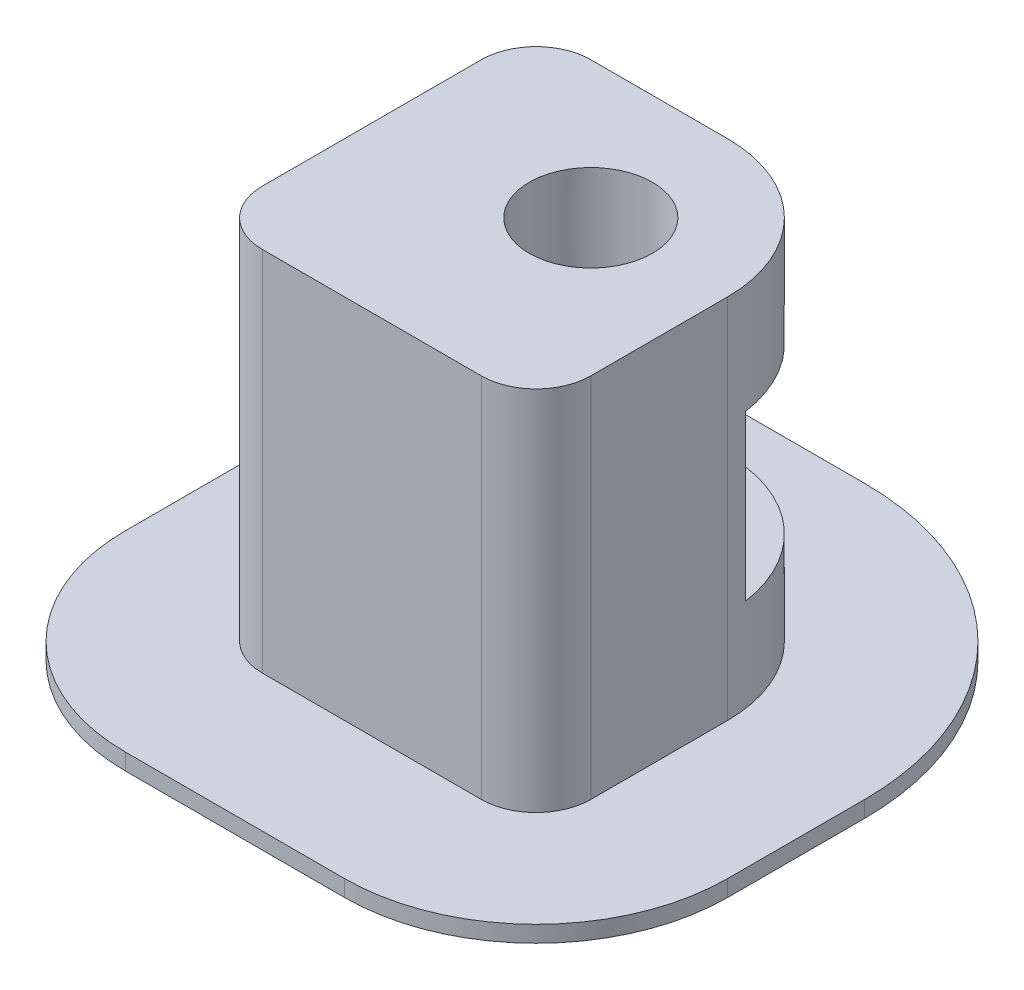
ISO-10303-21;
HEADER;
FILE_DESCRIPTION(('STEP AP214'),'2;1');
FILE_NAME('part.step','',(''),(''),'','','');
FILE_SCHEMA(('AUTOMOTIVE_DESIGN { 1 0 10303 214 1 1 1 1 }'));
ENDSEC;
DATA;
#1=APPLICATION_CONTEXT('core data for automotive mechanical design processes');
#2=APPLICATION_PROTOCOL_DEFINITION('international standard','automotive_design',2000,#1);
#3=PRODUCT_CONTEXT('',#1,'mechanical');
#4=PRODUCT('Part','Part','',(#3));
#5=PRODUCT_RELATED_PRODUCT_CATEGORY('part','',(#4));
#6=PRODUCT_DEFINITION_FORMATION('','',#4);
#7=PRODUCT_DEFINITION_CONTEXT('part definition',#1,'design');
#8=PRODUCT_DEFINITION('design','',#6,#7);
#9=PRODUCT_DEFINITION_SHAPE('','',#8);
#10=(LENGTH_UNIT() NAMED_UNIT(*) SI_UNIT(.MILLI.,.METRE.));
#11=(NAMED_UNIT(*) PLANE_ANGLE_UNIT() SI_UNIT($,.RADIAN.));
#12=(NAMED_UNIT(*) SI_UNIT($,.STERADIAN.) SOLID_ANGLE_UNIT());
#13=UNCERTAINTY_MEASURE_WITH_UNIT(LENGTH_MEASURE(1.E-05),#10,'distance_accuracy_value','');
#14=(GEOMETRIC_REPRESENTATION_CONTEXT(3) GLOBAL_UNCERTAINTY_ASSIGNED_CONTEXT((#13)) GLOBAL_UNIT_ASSIGNED_CONTEXT((#10,
#11,#12)) REPRESENTATION_CONTEXT('',''));
#15=CARTESIAN_POINT('',(0.,0.,0.));
#16=DIRECTION('',(0.,0.,1.));
#17=DIRECTION('',(1.,0.,0.));
#18=AXIS2_PLACEMENT_3D('',#15,#16,#17);
#19=CARTESIAN_POINT('',(0.,7.,0.));
#20=DIRECTION('',(0.,-1.,0.));
#21=DIRECTION('',(0.,0.,-1.));
#22=AXIS2_PLACEMENT_3D('',#19,#20,#21);
#23=CYLINDRICAL_SURFACE('',#22,5.);
#24=CARTESIAN_POINT('',(0.,-3.,0.));
#25=DIRECTION('',(0.,-1.,0.));
#26=DIRECTION('',(0.,0.,-1.));
#27=AXIS2_PLACEMENT_3D('',#24,#25,#26);
#28=CIRCLE('',#27,5.);
#29=CARTESIAN_POINT('',(0.707106781177616,-3.,-4.94974746830711));
#30=VERTEX_POINT('',#29);
#31=CARTESIAN_POINT('',(4.94974746830837,-3.,-0.707106781168817));
#32=VERTEX_POINT('',#31);
#33=EDGE_CURVE('E281',#30,#32,#28,.T.);
#34=ORIENTED_EDGE('',*,*,#33,.T.);
#35=DIRECTION('',(0.,-1.,0.));
#36=VECTOR('',#35,1.);
#37=CARTESIAN_POINT('',(4.94974746830334,7.,-0.707106781203986));
#38=LINE('',#37,#36);
#39=CARTESIAN_POINT('',(4.94974746829832,3.,-0.707106781239157));
#40=VERTEX_POINT('',#39);
#41=EDGE_CURVE('E346',#40,#32,#38,.T.);
#42=ORIENTED_EDGE('',*,*,#41,.F.);
#43=CARTESIAN_POINT('',(0.,3.,0.));
#44=DIRECTION('',(0.,-1.,0.));
#45=DIRECTION('',(0.,0.,-1.));
#46=AXIS2_PLACEMENT_3D('',#43,#44,#45);
#47=CIRCLE('',#46,5.);
#48=CARTESIAN_POINT('',(0.707106781203994,3.,-4.94974746830334));
#49=VERTEX_POINT('',#48);
#50=EDGE_CURVE('E300',#49,#40,#47,.T.);
#51=ORIENTED_EDGE('',*,*,#50,.F.);
#52=DIRECTION('',(0.,-1.,0.));
#53=VECTOR('',#52,1.);
#54=CARTESIAN_POINT('',(0.707106781203994,7.,-4.94974746830334));
#55=LINE('',#54,#53);
#56=EDGE_CURVE('E40',#30,#49,#55,.F.);
#57=ORIENTED_EDGE('',*,*,#56,.F.);
#58=EDGE_LOOP('',(#34,#42,#51,#57));
#59=FACE_BOUND('',#58,.T.);
#60=CARTESIAN_POINT('',(0.,-6.4,0.));
#61=DIRECTION('',(0.,-1.,0.));
#62=DIRECTION('',(0.,0.,-1.));
#63=AXIS2_PLACEMENT_3D('',#60,#61,#62);
#64=CIRCLE('',#63,5.);
#65=CARTESIAN_POINT('',(0.,-6.4,-5.));
#66=VERTEX_POINT('',#65);
#67=CARTESIAN_POINT('',(5.,-6.4,0.));
#68=VERTEX_POINT('',#67);
#69=EDGE_CURVE('E252',#66,#68,#64,.T.);
#70=ORIENTED_EDGE('',*,*,#69,.F.);
#71=DIRECTION('',(0.,-1.,0.));
#72=VECTOR('',#71,1.);
#73=CARTESIAN_POINT('',(0.,7.,-5.));
#74=LINE('',#73,#72);
#75=CARTESIAN_POINT('',(0.,7.,-5.));
#76=VERTEX_POINT('',#75);
#77=EDGE_CURVE('E322',#76,#66,#74,.T.);
#78=ORIENTED_EDGE('',*,*,#77,.F.);
#79=CARTESIAN_POINT('',(0.,7.,0.));
#80=DIRECTION('',(0.,1.,0.));
#81=DIRECTION('',(0.,0.,1.));
#82=AXIS2_PLACEMENT_3D('',#79,#80,#81);
#83=CIRCLE('',#82,5.);
#84=CARTESIAN_POINT('',(5.,7.,0.));
#85=VERTEX_POINT('',#84);
#86=EDGE_CURVE('E305',#85,#76,#83,.T.);
#87=ORIENTED_EDGE('',*,*,#86,.F.);
#88=DIRECTION('',(0.,-1.,0.));
#89=VECTOR('',#88,1.);
#90=CARTESIAN_POINT('',(5.,7.,0.));
#91=LINE('',#90,#89);
#92=EDGE_CURVE('E319',#85,#68,#91,.T.);
#93=ORIENTED_EDGE('',*,*,#92,.T.);
#94=EDGE_LOOP('',(#70,#78,#87,#93));
#95=FACE_BOUND('',#94,.T.);
#96=ADVANCED_FACE('F32',(#59,#95),#23,.T.);
#97=CARTESIAN_POINT('',(0.,7.,-5.));
#98=DIRECTION('',(0.,0.,1.));
#99=DIRECTION('',(1.,0.,0.));
#100=AXIS2_PLACEMENT_3D('',#97,#98,#99);
#101=PLANE('',#100);
#102=DIRECTION('',(1.,0.,0.));
#103=VECTOR('',#102,1.);
#104=CARTESIAN_POINT('',(0.,-6.4,-5.));
#105=LINE('',#104,#103);
#106=CARTESIAN_POINT('',(-5.,-6.4,-5.));
#107=VERTEX_POINT('',#106);
#108=EDGE_CURVE('E250',#107,#66,#105,.T.);
#109=ORIENTED_EDGE('',*,*,#108,.F.);
#110=DIRECTION('',(0.,-1.,0.));
#111=VECTOR('',#110,1.);
#112=CARTESIAN_POINT('',(-5.,7.,-5.));
#113=LINE('',#112,#111);
#114=CARTESIAN_POINT('',(-5.,7.,-5.));
#115=VERTEX_POINT('',#114);
#116=EDGE_CURVE('E344',#107,#115,#113,.F.);
#117=ORIENTED_EDGE('',*,*,#116,.T.);
#118=DIRECTION('',(-1.,0.,0.));
#119=VECTOR('',#118,1.);
#120=CARTESIAN_POINT('',(0.,7.,-5.));
#121=LINE('',#120,#119);
#122=EDGE_CURVE('E308',#76,#115,#121,.T.);
#123=ORIENTED_EDGE('',*,*,#122,.F.);
#124=ORIENTED_EDGE('',*,*,#77,.T.);
#125=EDGE_LOOP('',(#109,#117,#123,#124));
#126=FACE_BOUND('',#125,.T.);
#127=ADVANCED_FACE('F389',(#126),#101,.F.);
#128=CARTESIAN_POINT('',(-7.,7.,-5.));
#129=DIRECTION('',(1.,0.,0.));
#130=DIRECTION('',(0.,0.,-1.));
#131=AXIS2_PLACEMENT_3D('',#128,#129,#130);
#132=PLANE('',#131);
#133=DIRECTION('',(0.,0.,-1.));
#134=VECTOR('',#133,1.);
#135=CARTESIAN_POINT('',(-7.,-6.4,-5.));
#136=LINE('',#135,#134);
#137=CARTESIAN_POINT('',(-7.,-6.4,5.));
#138=VERTEX_POINT('',#137);
#139=CARTESIAN_POINT('',(-7.,-6.4,-3.));
#140=VERTEX_POINT('',#139);
#141=EDGE_CURVE('E47',#138,#140,#136,.T.);
#142=ORIENTED_EDGE('',*,*,#141,.F.);
#143=DIRECTION('',(0.,-1.,0.));
#144=VECTOR('',#143,1.);
#145=CARTESIAN_POINT('',(-7.,7.,5.));
#146=LINE('',#145,#144);
#147=CARTESIAN_POINT('',(-7.,7.,5.));
#148=VERTEX_POINT('',#147);
#149=EDGE_CURVE('E342',#138,#148,#146,.F.);
#150=ORIENTED_EDGE('',*,*,#149,.T.);
#151=DIRECTION('',(0.,0.,1.));
#152=VECTOR('',#151,1.);
#153=CARTESIAN_POINT('',(-7.,7.,-5.));
#154=LINE('',#153,#152);
#155=CARTESIAN_POINT('',(-7.,7.,-3.));
#156=VERTEX_POINT('',#155);
#157=EDGE_CURVE('E311',#156,#148,#154,.T.);
#158=ORIENTED_EDGE('',*,*,#157,.F.);
#159=DIRECTION('',(0.,-1.,0.));
#160=VECTOR('',#159,1.);
#161=CARTESIAN_POINT('',(-7.,7.,-3.));
#162=LINE('',#161,#160);
#163=EDGE_CURVE('E339',#156,#140,#162,.T.);
#164=ORIENTED_EDGE('',*,*,#163,.T.);
#165=EDGE_LOOP('',(#142,#150,#158,#164));
#166=FACE_BOUND('',#165,.T.);
#167=ADVANCED_FACE('F394',(#166),#132,.F.);
#168=CARTESIAN_POINT('',(-7.,7.,7.));
#169=DIRECTION('',(0.,0.,-1.));
#170=DIRECTION('',(-1.,0.,0.));
#171=AXIS2_PLACEMENT_3D('',#168,#169,#170);
#172=PLANE('',#171);
#173=DIRECTION('',(-1.,0.,0.));
#174=VECTOR('',#173,1.);
#175=CARTESIAN_POINT('',(-7.,-6.4,7.));
#176=LINE('',#175,#174);
#177=CARTESIAN_POINT('',(3.,-6.4,7.));
#178=VERTEX_POINT('',#177);
#179=CARTESIAN_POINT('',(-5.,-6.4,7.));
#180=VERTEX_POINT('',#179);
#181=EDGE_CURVE('E259',#178,#180,#176,.T.);
#182=ORIENTED_EDGE('',*,*,#181,.F.);
#183=DIRECTION('',(0.,-1.,0.));
#184=VECTOR('',#183,1.);
#185=CARTESIAN_POINT('',(3.,7.,7.));
#186=LINE('',#185,#184);
#187=CARTESIAN_POINT('',(3.,7.,7.));
#188=VERTEX_POINT('',#187);
#189=EDGE_CURVE('E331',#178,#188,#186,.F.);
#190=ORIENTED_EDGE('',*,*,#189,.T.);
#191=DIRECTION('',(1.,0.,0.));
#192=VECTOR('',#191,1.);
#193=CARTESIAN_POINT('',(-7.,7.,7.));
#194=LINE('',#193,#192);
#195=CARTESIAN_POINT('',(-5.,7.,7.));
#196=VERTEX_POINT('',#195);
#197=EDGE_CURVE('E314',#196,#188,#194,.T.);
#198=ORIENTED_EDGE('',*,*,#197,.F.);
#199=DIRECTION('',(0.,-1.,0.));
#200=VECTOR('',#199,1.);
#201=CARTESIAN_POINT('',(-5.,7.,7.));
#202=LINE('',#201,#200);
#203=EDGE_CURVE('E328',#196,#180,#202,.T.);
#204=ORIENTED_EDGE('',*,*,#203,.T.);
#205=EDGE_LOOP('',(#182,#190,#198,#204));
#206=FACE_BOUND('',#205,.T.);
#207=ADVANCED_FACE('F434',(#206),#172,.F.);
#208=CARTESIAN_POINT('',(5.,7.,7.));
#209=DIRECTION('',(-1.,0.,0.));
#210=DIRECTION('',(0.,0.,1.));
#211=AXIS2_PLACEMENT_3D('',#208,#209,#210);
#212=PLANE('',#211);
#213=DIRECTION('',(0.,0.,1.));
#214=VECTOR('',#213,1.);
#215=CARTESIAN_POINT('',(5.,-6.4,7.));
#216=LINE('',#215,#214);
#217=CARTESIAN_POINT('',(5.,-6.4,5.));
#218=VERTEX_POINT('',#217);
#219=EDGE_CURVE('E257',#68,#218,#216,.T.);
#220=ORIENTED_EDGE('',*,*,#219,.F.);
#221=ORIENTED_EDGE('',*,*,#92,.F.);
#222=DIRECTION('',(0.,0.,-1.));
#223=VECTOR('',#222,1.);
#224=CARTESIAN_POINT('',(5.,7.,7.));
#225=LINE('',#224,#223);
#226=CARTESIAN_POINT('',(5.,7.,5.));
#227=VERTEX_POINT('',#226);
#228=EDGE_CURVE('E317',#227,#85,#225,.T.);
#229=ORIENTED_EDGE('',*,*,#228,.F.);
#230=DIRECTION('',(0.,-1.,0.));
#231=VECTOR('',#230,1.);
#232=CARTESIAN_POINT('',(5.,7.,5.));
#233=LINE('',#232,#231);
#234=EDGE_CURVE('E325',#227,#218,#233,.T.);
#235=ORIENTED_EDGE('',*,*,#234,.T.);
#236=EDGE_LOOP('',(#220,#221,#229,#235));
#237=FACE_BOUND('',#236,.T.);
#238=ADVANCED_FACE('F402',(#237),#212,.F.);
#239=CARTESIAN_POINT('',(3.,7.,5.));
#240=DIRECTION('',(0.,-1.,0.));
#241=DIRECTION('',(0.,0.,-1.));
#242=AXIS2_PLACEMENT_3D('',#239,#240,#241);
#243=CYLINDRICAL_SURFACE('',#242,2.);
#244=ORIENTED_EDGE('',*,*,#189,.F.);
#245=CARTESIAN_POINT('',(3.,-6.4,5.));
#246=DIRECTION('',(0.,-1.,0.));
#247=DIRECTION('',(0.,0.,-1.));
#248=AXIS2_PLACEMENT_3D('',#245,#246,#247);
#249=CIRCLE('',#248,2.);
#250=EDGE_CURVE('E261',#178,#218,#249,.F.);
#251=ORIENTED_EDGE('',*,*,#250,.T.);
#252=ORIENTED_EDGE('',*,*,#234,.F.);
#253=CARTESIAN_POINT('',(3.,7.,5.));
#254=DIRECTION('',(0.,1.,0.));
#255=DIRECTION('',(0.,0.,1.));
#256=AXIS2_PLACEMENT_3D('',#253,#254,#255);
#257=CIRCLE('',#256,2.);
#258=EDGE_CURVE('E337',#188,#227,#257,.T.);
#259=ORIENTED_EDGE('',*,*,#258,.F.);
#260=EDGE_LOOP('',(#244,#251,#252,#259));
#261=FACE_BOUND('',#260,.T.);
#262=ADVANCED_FACE('F399',(#261),#243,.T.);
#263=CARTESIAN_POINT('',(-5.,7.,5.));
#264=DIRECTION('',(0.,-1.,0.));
#265=DIRECTION('',(0.,0.,-1.));
#266=AXIS2_PLACEMENT_3D('',#263,#264,#265);
#267=CYLINDRICAL_SURFACE('',#266,2.);
#268=ORIENTED_EDGE('',*,*,#149,.F.);
#269=CARTESIAN_POINT('',(-5.,-6.4,5.));
#270=DIRECTION('',(0.,-1.,0.));
#271=DIRECTION('',(0.,0.,-1.));
#272=AXIS2_PLACEMENT_3D('',#269,#270,#271);
#273=CIRCLE('',#272,2.);
#274=EDGE_CURVE('E254',#138,#180,#273,.F.);
#275=ORIENTED_EDGE('',*,*,#274,.T.);
#276=ORIENTED_EDGE('',*,*,#203,.F.);
#277=CARTESIAN_POINT('',(-5.,7.,5.));
#278=DIRECTION('',(0.,1.,0.));
#279=DIRECTION('',(0.,0.,1.));
#280=AXIS2_PLACEMENT_3D('',#277,#278,#279);
#281=CIRCLE('',#280,2.);
#282=EDGE_CURVE('E335',#148,#196,#281,.T.);
#283=ORIENTED_EDGE('',*,*,#282,.F.);
#284=EDGE_LOOP('',(#268,#275,#276,#283));
#285=FACE_BOUND('',#284,.T.);
#286=ADVANCED_FACE('F401',(#285),#267,.T.);
#287=CARTESIAN_POINT('',(-5.,7.,-3.));
#288=DIRECTION('',(0.,-1.,0.));
#289=DIRECTION('',(0.,0.,-1.));
#290=AXIS2_PLACEMENT_3D('',#287,#288,#289);
#291=CYLINDRICAL_SURFACE('',#290,2.);
#292=ORIENTED_EDGE('',*,*,#116,.F.);
#293=CARTESIAN_POINT('',(-5.,-6.4,-3.));
#294=DIRECTION('',(0.,-1.,0.));
#295=DIRECTION('',(0.,0.,-1.));
#296=AXIS2_PLACEMENT_3D('',#293,#294,#295);
#297=CIRCLE('',#296,2.);
#298=EDGE_CURVE('E11',#107,#140,#297,.F.);
#299=ORIENTED_EDGE('',*,*,#298,.T.);
#300=ORIENTED_EDGE('',*,*,#163,.F.);
#301=CARTESIAN_POINT('',(-5.,7.,-3.));
#302=DIRECTION('',(0.,1.,0.));
#303=DIRECTION('',(0.,0.,1.));
#304=AXIS2_PLACEMENT_3D('',#301,#302,#303);
#305=CIRCLE('',#304,2.);
#306=EDGE_CURVE('E333',#115,#156,#305,.T.);
#307=ORIENTED_EDGE('',*,*,#306,.F.);
#308=EDGE_LOOP('',(#292,#299,#300,#307));
#309=FACE_BOUND('',#308,.T.);
#310=ADVANCED_FACE('F34',(#309),#291,.T.);
#311=CARTESIAN_POINT('',(0.,7.,0.));
#312=DIRECTION('',(0.,1.,0.));
#313=DIRECTION('',(0.,0.,1.));
#314=AXIS2_PLACEMENT_3D('',#311,#312,#313);
#315=PLANE('',#314);
#316=CARTESIAN_POINT('',(0.,7.,0.));
#317=DIRECTION('',(0.,1.,0.));
#318=DIRECTION('',(0.,0.,1.));
#319=AXIS2_PLACEMENT_3D('',#316,#317,#318);
#320=CIRCLE('',#319,2.25);
#321=CARTESIAN_POINT('',(0.,7.,2.25));
#322=VERTEX_POINT('',#321);
#323=EDGE_CURVE('E264',#322,#322,#320,.T.);
#324=ORIENTED_EDGE('',*,*,#323,.F.);
#325=EDGE_LOOP('',(#324));
#326=FACE_BOUND('',#325,.T.);
#327=ORIENTED_EDGE('',*,*,#197,.T.);
#328=ORIENTED_EDGE('',*,*,#258,.T.);
#329=ORIENTED_EDGE('',*,*,#228,.T.);
#330=ORIENTED_EDGE('',*,*,#86,.T.);
#331=ORIENTED_EDGE('',*,*,#122,.T.);
#332=ORIENTED_EDGE('',*,*,#306,.T.);
#333=ORIENTED_EDGE('',*,*,#157,.T.);
#334=ORIENTED_EDGE('',*,*,#282,.T.);
#335=EDGE_LOOP('',(#327,#328,#329,#330,#331,#332,#333,#334));
#336=FACE_BOUND('',#335,.T.);
#337=ADVANCED_FACE('F409',(#326,#336),#315,.T.);
#338=CARTESIAN_POINT('',(0.,-7.,0.));
#339=DIRECTION('',(0.,1.,0.));
#340=DIRECTION('',(0.,0.,1.));
#341=AXIS2_PLACEMENT_3D('',#338,#339,#340);
#342=PLANE('',#341);
#343=CARTESIAN_POINT('',(0.,-7.,0.));
#344=DIRECTION('',(0.,1.,0.));
#345=DIRECTION('',(0.,0.,1.));
#346=AXIS2_PLACEMENT_3D('',#343,#344,#345);
#347=CIRCLE('',#346,1.6);
#348=CARTESIAN_POINT('',(0.,-7.,1.6));
#349=VERTEX_POINT('',#348);
#350=EDGE_CURVE('E302',#349,#349,#347,.T.);
#351=ORIENTED_EDGE('',*,*,#350,.T.);
#352=EDGE_LOOP('',(#351));
#353=FACE_BOUND('',#352,.T.);
#354=CARTESIAN_POINT('',(3.,-7.,5.));
#355=DIRECTION('',(0.,-1.,0.));
#356=DIRECTION('',(0.,0.,-1.));
#357=AXIS2_PLACEMENT_3D('',#354,#355,#356);
#358=CIRCLE('',#357,7.);
#359=CARTESIAN_POINT('',(10.,-7.,5.));
#360=VERTEX_POINT('',#359);
#361=CARTESIAN_POINT('',(3.,-7.,12.));
#362=VERTEX_POINT('',#361);
#363=EDGE_CURVE('E220',#360,#362,#358,.T.);
#364=ORIENTED_EDGE('',*,*,#363,.T.);
#365=DIRECTION('',(-1.,0.,0.));
#366=VECTOR('',#365,1.);
#367=CARTESIAN_POINT('',(3.,-7.,12.));
#368=LINE('',#367,#366);
#369=CARTESIAN_POINT('',(-5.,-7.,12.));
#370=VERTEX_POINT('',#369);
#371=EDGE_CURVE('E179',#362,#370,#368,.T.);
#372=ORIENTED_EDGE('',*,*,#371,.T.);
#373=CARTESIAN_POINT('',(-5.,-7.,5.));
#374=DIRECTION('',(0.,-1.,0.));
#375=DIRECTION('',(0.,0.,-1.));
#376=AXIS2_PLACEMENT_3D('',#373,#374,#375);
#377=CIRCLE('',#376,7.);
#378=CARTESIAN_POINT('',(-12.,-7.,5.));
#379=VERTEX_POINT('',#378);
#380=EDGE_CURVE('E223',#370,#379,#377,.T.);
#381=ORIENTED_EDGE('',*,*,#380,.T.);
#382=DIRECTION('',(0.,0.,-1.));
#383=VECTOR('',#382,1.);
#384=CARTESIAN_POINT('',(-12.,-7.,5.));
#385=LINE('',#384,#383);
#386=CARTESIAN_POINT('',(-12.,-7.,-3.));
#387=VERTEX_POINT('',#386);
#388=EDGE_CURVE('E226',#379,#387,#385,.T.);
#389=ORIENTED_EDGE('',*,*,#388,.T.);
#390=CARTESIAN_POINT('',(-5.,-7.,-3.));
#391=DIRECTION('',(0.,-1.,0.));
#392=DIRECTION('',(0.,0.,-1.));
#393=AXIS2_PLACEMENT_3D('',#390,#391,#392);
#394=CIRCLE('',#393,7.);
#395=CARTESIAN_POINT('',(-5.,-7.,-10.));
#396=VERTEX_POINT('',#395);
#397=EDGE_CURVE('E229',#387,#396,#394,.T.);
#398=ORIENTED_EDGE('',*,*,#397,.T.);
#399=DIRECTION('',(1.,0.,0.));
#400=VECTOR('',#399,1.);
#401=CARTESIAN_POINT('',(-5.,-7.,-10.));
#402=LINE('',#401,#400);
#403=CARTESIAN_POINT('',(0.,-7.,-10.));
#404=VERTEX_POINT('',#403);
#405=EDGE_CURVE('E232',#396,#404,#402,.T.);
#406=ORIENTED_EDGE('',*,*,#405,.T.);
#407=CARTESIAN_POINT('',(0.,-7.,0.));
#408=DIRECTION('',(0.,-1.,0.));
#409=DIRECTION('',(0.,0.,-1.));
#410=AXIS2_PLACEMENT_3D('',#407,#408,#409);
#411=CIRCLE('',#410,10.);
#412=CARTESIAN_POINT('',(10.,-7.,0.));
#413=VERTEX_POINT('',#412);
#414=EDGE_CURVE('E203',#404,#413,#411,.T.);
#415=ORIENTED_EDGE('',*,*,#414,.T.);
#416=DIRECTION('',(0.,0.,1.));
#417=VECTOR('',#416,1.);
#418=CARTESIAN_POINT('',(10.,-7.,0.));
#419=LINE('',#418,#417);
#420=EDGE_CURVE('E200',#413,#360,#419,.T.);
#421=ORIENTED_EDGE('',*,*,#420,.T.);
#422=EDGE_LOOP('',(#364,#372,#381,#389,#398,#406,#415,#421));
#423=FACE_BOUND('',#422,.T.);
#424=ADVANCED_FACE('F443',(#353,#423),#342,.F.);
#425=CARTESIAN_POINT('',(0.,7.,0.));
#426=DIRECTION('',(0.,-1.,0.));
#427=DIRECTION('',(0.,0.,-1.));
#428=AXIS2_PLACEMENT_3D('',#425,#426,#427);
#429=CYLINDRICAL_SURFACE('',#428,1.6);
#430=ORIENTED_EDGE('',*,*,#350,.F.);
#431=EDGE_LOOP('',(#430));
#432=FACE_BOUND('',#431,.T.);
#433=CARTESIAN_POINT('',(0.,-3.,0.));
#434=DIRECTION('',(0.,-1.,0.));
#435=DIRECTION('',(0.,0.,-1.));
#436=AXIS2_PLACEMENT_3D('',#433,#434,#435);
#437=CIRCLE('',#436,1.6);
#438=CARTESIAN_POINT('',(0.,-3.,-1.6));
#439=VERTEX_POINT('',#438);
#440=EDGE_CURVE('E280',#439,#439,#437,.T.);
#441=ORIENTED_EDGE('',*,*,#440,.F.);
#442=EDGE_LOOP('',(#441));
#443=FACE_BOUND('',#442,.T.);
#444=ADVANCED_FACE('F446',(#432,#443),#429,.F.);
#445=CARTESIAN_POINT('',(-345799.821320344,0.,345795.578679656));
#446=DIRECTION('',(0.707106781186547,0.,0.707106781186548));
#447=DIRECTION('',(0.707106781186548,0.,-0.707106781186547));
#448=AXIS2_PLACEMENT_3D('',#445,#446,#447);
#449=PLANE('',#448);
#450=ORIENTED_EDGE('',*,*,#56,.T.);
#451=DIRECTION('',(0.707106781186548,0.,-0.707106781186547));
#452=VECTOR('',#451,1.);
#453=CARTESIAN_POINT('',(-345799.821320344,3.,345795.578679656));
#454=LINE('',#453,#452);
#455=CARTESIAN_POINT('',(-3.34606521482783,3.,-0.896575472211225));
#456=VERTEX_POINT('',#455);
#457=EDGE_CURVE('E54',#456,#49,#454,.T.);
#458=ORIENTED_EDGE('',*,*,#457,.F.);
#459=DIRECTION('',(0.,1.,0.));
#460=VECTOR('',#459,1.);
#461=CARTESIAN_POINT('',(-3.34606521482783,0.,-0.896575472211225));
#462=LINE('',#461,#460);
#463=CARTESIAN_POINT('',(-3.34606521488467,-3.,-0.896575472182803));
#464=VERTEX_POINT('',#463);
#465=EDGE_CURVE('E291',#464,#456,#462,.T.);
#466=ORIENTED_EDGE('',*,*,#465,.F.);
#467=DIRECTION('',(0.707106781186548,0.,-0.707106781186547));
#468=VECTOR('',#467,1.);
#469=CARTESIAN_POINT('',(54200.1786796566,-3.,-54204.4213203437));
#470=LINE('',#469,#468);
#471=EDGE_CURVE('E274',#464,#30,#470,.T.);
#472=ORIENTED_EDGE('',*,*,#471,.T.);
#473=EDGE_LOOP('',(#450,#458,#466,#472));
#474=FACE_BOUND('',#473,.T.);
#475=ADVANCED_FACE('F376',(#474),#449,.T.);
#476=CARTESIAN_POINT('',(-345795.578679657,0.,345799.821320343));
#477=DIRECTION('',(-0.707106781186547,0.,-0.707106781186548));
#478=DIRECTION('',(-0.707106781186548,0.,0.707106781186547));
#479=AXIS2_PLACEMENT_3D('',#476,#477,#478);
#480=PLANE('',#479);
#481=ORIENTED_EDGE('',*,*,#41,.T.);
#482=DIRECTION('',(-0.707106781186548,0.,0.707106781186547));
#483=VECTOR('',#482,1.);
#484=CARTESIAN_POINT('',(54204.421320344,-3.,-54200.1786796567));
#485=LINE('',#484,#483);
#486=CARTESIAN_POINT('',(0.896575471983851,-3.,3.34606521488467));
#487=VERTEX_POINT('',#486);
#488=EDGE_CURVE('E277',#32,#487,#485,.T.);
#489=ORIENTED_EDGE('',*,*,#488,.T.);
#490=DIRECTION('',(0.,1.,0.));
#491=VECTOR('',#490,1.);
#492=CARTESIAN_POINT('',(0.896575472381755,0.,3.34606521502678));
#493=LINE('',#492,#491);
#494=CARTESIAN_POINT('',(0.896575472381755,3.,3.34606521502678));
#495=VERTEX_POINT('',#494);
#496=EDGE_CURVE('E297',#487,#495,#493,.T.);
#497=ORIENTED_EDGE('',*,*,#496,.T.);
#498=DIRECTION('',(-0.707106781186548,0.,0.707106781186547));
#499=VECTOR('',#498,1.);
#500=CARTESIAN_POINT('',(-345795.578679657,3.,345799.821320343));
#501=LINE('',#500,#499);
#502=EDGE_CURVE('E289',#40,#495,#501,.T.);
#503=ORIENTED_EDGE('',*,*,#502,.F.);
#504=EDGE_LOOP('',(#481,#489,#497,#503));
#505=FACE_BOUND('',#504,.T.);
#506=ADVANCED_FACE('F359',(#505),#480,.T.);
#507=CARTESIAN_POINT('',(0.,3.,0.));
#508=DIRECTION('',(0.,-1.,0.));
#509=DIRECTION('',(0.,0.,-1.));
#510=AXIS2_PLACEMENT_3D('',#507,#508,#509);
#511=PLANE('',#510);
#512=CARTESIAN_POINT('',(0.,3.,0.));
#513=DIRECTION('',(0.,-1.,0.));
#514=DIRECTION('',(0.,0.,-1.));
#515=AXIS2_PLACEMENT_3D('',#512,#513,#514);
#516=CIRCLE('',#515,2.25);
#517=CARTESIAN_POINT('',(0.,3.,-2.25));
#518=VERTEX_POINT('',#517);
#519=EDGE_CURVE('E267',#518,#518,#516,.T.);
#520=ORIENTED_EDGE('',*,*,#519,.F.);
#521=EDGE_LOOP('',(#520));
#522=FACE_BOUND('',#521,.T.);
#523=ORIENTED_EDGE('',*,*,#50,.T.);
#524=ORIENTED_EDGE('',*,*,#502,.T.);
#525=DIRECTION('',(-0.965925826289069,0.,-0.258819045102521));
#526=VECTOR('',#525,1.);
#527=CARTESIAN_POINT('',(-300308.190226725,3.,-80464.2312231616));
#528=LINE('',#527,#526);
#529=CARTESIAN_POINT('',(-2.44948974278003,3.,2.44948974281556));
#530=VERTEX_POINT('',#529);
#531=EDGE_CURVE('E284',#495,#530,#528,.T.);
#532=ORIENTED_EDGE('',*,*,#531,.T.);
#533=DIRECTION('',(-0.25881904510252,0.,-0.965925826289069));
#534=VECTOR('',#533,1.);
#535=CARTESIAN_POINT('',(46100.7159921107,3.,172061.805457776));
#536=LINE('',#535,#534);
#537=EDGE_CURVE('E286',#530,#456,#536,.T.);
#538=ORIENTED_EDGE('',*,*,#537,.T.);
#539=ORIENTED_EDGE('',*,*,#457,.T.);
#540=EDGE_LOOP('',(#523,#524,#532,#538,#539));
#541=FACE_BOUND('',#540,.T.);
#542=ADVANCED_FACE('F356',(#522,#541),#511,.T.);
#543=CARTESIAN_POINT('',(-300308.190226725,0.,-80464.2312231616));
#544=DIRECTION('',(0.25881904510252,0.,-0.965925826289068));
#545=DIRECTION('',(-0.965925826289069,0.,-0.258819045102521));
#546=AXIS2_PLACEMENT_3D('',#543,#544,#545);
#547=PLANE('',#546);
#548=ORIENTED_EDGE('',*,*,#531,.F.);
#549=ORIENTED_EDGE('',*,*,#496,.F.);
#550=DIRECTION('',(-0.965925826289069,0.,-0.258819045102521));
#551=VECTOR('',#550,1.);
#552=CARTESIAN_POINT('',(446101.971287051,-3.,119535.768776838));
#553=LINE('',#552,#551);
#554=CARTESIAN_POINT('',(-2.44948974280135,-3.,2.44948974255976));
#555=VERTEX_POINT('',#554);
#556=EDGE_CURVE('E268',#487,#555,#553,.T.);
#557=ORIENTED_EDGE('',*,*,#556,.T.);
#558=DIRECTION('',(0.,1.,0.));
#559=VECTOR('',#558,1.);
#560=CARTESIAN_POINT('',(-2.44948974278003,0.,2.44948974281556));
#561=LINE('',#560,#559);
#562=EDGE_CURVE('E294',#555,#530,#561,.T.);
#563=ORIENTED_EDGE('',*,*,#562,.T.);
#564=EDGE_LOOP('',(#548,#549,#557,#563));
#565=FACE_BOUND('',#564,.T.);
#566=ADVANCED_FACE('F358',(#565),#547,.T.);
#567=CARTESIAN_POINT('',(46100.7159921107,0.,172061.805457776));
#568=DIRECTION('',(0.965925826289068,0.,-0.25881904510252));
#569=DIRECTION('',(-0.25881904510252,0.,-0.965925826289069));
#570=AXIS2_PLACEMENT_3D('',#567,#568,#569);
#571=PLANE('',#570);
#572=ORIENTED_EDGE('',*,*,#537,.F.);
#573=ORIENTED_EDGE('',*,*,#562,.F.);
#574=DIRECTION('',(-0.25881904510252,0.,-0.965925826289069));
#575=VECTOR('',#574,1.);
#576=CARTESIAN_POINT('',(99690.5544783352,-3.,372061.805457776));
#577=LINE('',#576,#575);
#578=EDGE_CURVE('E271',#555,#464,#577,.T.);
#579=ORIENTED_EDGE('',*,*,#578,.T.);
#580=ORIENTED_EDGE('',*,*,#465,.T.);
#581=EDGE_LOOP('',(#572,#573,#579,#580));
#582=FACE_BOUND('',#581,.T.);
#583=ADVANCED_FACE('F379',(#582),#571,.T.);
#584=CARTESIAN_POINT('',(0.,-3.,0.));
#585=DIRECTION('',(0.,-1.,0.));
#586=DIRECTION('',(0.,0.,-1.));
#587=AXIS2_PLACEMENT_3D('',#584,#585,#586);
#588=PLANE('',#587);
#589=ORIENTED_EDGE('',*,*,#440,.T.);
#590=EDGE_LOOP('',(#589));
#591=FACE_BOUND('',#590,.T.);
#592=ORIENTED_EDGE('',*,*,#471,.F.);
#593=ORIENTED_EDGE('',*,*,#578,.F.);
#594=ORIENTED_EDGE('',*,*,#556,.F.);
#595=ORIENTED_EDGE('',*,*,#488,.F.);
#596=ORIENTED_EDGE('',*,*,#33,.F.);
#597=EDGE_LOOP('',(#592,#593,#594,#595,#596));
#598=FACE_BOUND('',#597,.T.);
#599=ADVANCED_FACE('F372',(#591,#598),#588,.F.);
#600=CARTESIAN_POINT('',(0.,0.,0.));
#601=DIRECTION('',(0.,1.,0.));
#602=DIRECTION('',(0.,0.,1.));
#603=AXIS2_PLACEMENT_3D('',#600,#601,#602);
#604=CYLINDRICAL_SURFACE('',#603,2.25);
#605=ORIENTED_EDGE('',*,*,#519,.T.);
#606=EDGE_LOOP('',(#605));
#607=FACE_BOUND('',#606,.T.);
#608=ORIENTED_EDGE('',*,*,#323,.T.);
#609=EDGE_LOOP('',(#608));
#610=FACE_BOUND('',#609,.T.);
#611=ADVANCED_FACE('F353',(#607,#610),#604,.F.);
#612=CARTESIAN_POINT('',(3.,-6.4,5.));
#613=DIRECTION('',(0.,-1.,0.));
#614=DIRECTION('',(0.,0.,-1.));
#615=AXIS2_PLACEMENT_3D('',#612,#613,#614);
#616=CYLINDRICAL_SURFACE('',#615,7.);
#617=ORIENTED_EDGE('',*,*,#363,.F.);
#618=DIRECTION('',(0.,-1.,0.));
#619=VECTOR('',#618,1.);
#620=CARTESIAN_POINT('',(10.,-6.4,5.));
#621=LINE('',#620,#619);
#622=CARTESIAN_POINT('',(10.,-6.4,5.));
#623=VERTEX_POINT('',#622);
#624=EDGE_CURVE('E199',#623,#360,#621,.T.);
#625=ORIENTED_EDGE('',*,*,#624,.F.);
#626=CARTESIAN_POINT('',(3.,-6.4,5.));
#627=DIRECTION('',(0.,-1.,0.));
#628=DIRECTION('',(0.,0.,-1.));
#629=AXIS2_PLACEMENT_3D('',#626,#627,#628);
#630=CIRCLE('',#629,7.);
#631=CARTESIAN_POINT('',(3.,-6.4,12.));
#632=VERTEX_POINT('',#631);
#633=EDGE_CURVE('E192',#623,#632,#630,.T.);
#634=ORIENTED_EDGE('',*,*,#633,.T.);
#635=DIRECTION('',(0.,-1.,0.));
#636=VECTOR('',#635,1.);
#637=CARTESIAN_POINT('',(3.,-6.4,12.));
#638=LINE('',#637,#636);
#639=EDGE_CURVE('E174',#632,#362,#638,.T.);
#640=ORIENTED_EDGE('',*,*,#639,.T.);
#641=EDGE_LOOP('',(#617,#625,#634,#640));
#642=FACE_BOUND('',#641,.T.);
#643=ADVANCED_FACE('F198',(#642),#616,.T.);
#644=CARTESIAN_POINT('',(10.,-6.4,0.));
#645=DIRECTION('',(1.,0.,0.));
#646=DIRECTION('',(0.,0.,-1.));
#647=AXIS2_PLACEMENT_3D('',#644,#645,#646);
#648=PLANE('',#647);
#649=ORIENTED_EDGE('',*,*,#420,.F.);
#650=DIRECTION('',(0.,-1.,0.));
#651=VECTOR('',#650,1.);
#652=CARTESIAN_POINT('',(10.,-6.4,0.));
#653=LINE('',#652,#651);
#654=CARTESIAN_POINT('',(10.,-6.4,0.));
#655=VERTEX_POINT('',#654);
#656=EDGE_CURVE('E238',#655,#413,#653,.T.);
#657=ORIENTED_EDGE('',*,*,#656,.F.);
#658=DIRECTION('',(0.,0.,1.));
#659=VECTOR('',#658,1.);
#660=CARTESIAN_POINT('',(10.,-6.4,0.));
#661=LINE('',#660,#659);
#662=EDGE_CURVE('E185',#655,#623,#661,.T.);
#663=ORIENTED_EDGE('',*,*,#662,.T.);
#664=ORIENTED_EDGE('',*,*,#624,.T.);
#665=EDGE_LOOP('',(#649,#657,#663,#664));
#666=FACE_BOUND('',#665,.T.);
#667=ADVANCED_FACE('F552',(#666),#648,.T.);
#668=CARTESIAN_POINT('',(0.,-6.4,0.));
#669=DIRECTION('',(0.,-1.,0.));
#670=DIRECTION('',(0.,0.,-1.));
#671=AXIS2_PLACEMENT_3D('',#668,#669,#670);
#672=CYLINDRICAL_SURFACE('',#671,10.);
#673=ORIENTED_EDGE('',*,*,#414,.F.);
#674=DIRECTION('',(0.,-1.,0.));
#675=VECTOR('',#674,1.);
#676=CARTESIAN_POINT('',(0.,-6.4,-10.));
#677=LINE('',#676,#675);
#678=CARTESIAN_POINT('',(0.,-6.4,-10.));
#679=VERTEX_POINT('',#678);
#680=EDGE_CURVE('E240',#679,#404,#677,.T.);
#681=ORIENTED_EDGE('',*,*,#680,.F.);
#682=CARTESIAN_POINT('',(0.,-6.4,0.));
#683=DIRECTION('',(0.,-1.,0.));
#684=DIRECTION('',(0.,0.,-1.));
#685=AXIS2_PLACEMENT_3D('',#682,#683,#684);
#686=CIRCLE('',#685,10.);
#687=EDGE_CURVE('E216',#679,#655,#686,.T.);
#688=ORIENTED_EDGE('',*,*,#687,.T.);
#689=ORIENTED_EDGE('',*,*,#656,.T.);
#690=EDGE_LOOP('',(#673,#681,#688,#689));
#691=FACE_BOUND('',#690,.T.);
#692=ADVANCED_FACE('F560',(#691),#672,.T.);
#693=CARTESIAN_POINT('',(-5.,-6.4,-10.));
#694=DIRECTION('',(0.,0.,-1.));
#695=DIRECTION('',(-1.,0.,0.));
#696=AXIS2_PLACEMENT_3D('',#693,#694,#695);
#697=PLANE('',#696);
#698=ORIENTED_EDGE('',*,*,#405,.F.);
#699=DIRECTION('',(0.,-1.,0.));
#700=VECTOR('',#699,1.);
#701=CARTESIAN_POINT('',(-5.,-6.4,-10.));
#702=LINE('',#701,#700);
#703=CARTESIAN_POINT('',(-5.,-6.4,-10.));
#704=VERTEX_POINT('',#703);
#705=EDGE_CURVE('E242',#704,#396,#702,.T.);
#706=ORIENTED_EDGE('',*,*,#705,.F.);
#707=DIRECTION('',(1.,0.,0.));
#708=VECTOR('',#707,1.);
#709=CARTESIAN_POINT('',(-5.,-6.4,-10.));
#710=LINE('',#709,#708);
#711=EDGE_CURVE('E213',#704,#679,#710,.T.);
#712=ORIENTED_EDGE('',*,*,#711,.T.);
#713=ORIENTED_EDGE('',*,*,#680,.T.);
#714=EDGE_LOOP('',(#698,#706,#712,#713));
#715=FACE_BOUND('',#714,.T.);
#716=ADVANCED_FACE('F570',(#715),#697,.T.);
#717=CARTESIAN_POINT('',(-5.,-6.4,-3.));
#718=DIRECTION('',(0.,-1.,0.));
#719=DIRECTION('',(0.,0.,-1.));
#720=AXIS2_PLACEMENT_3D('',#717,#718,#719);
#721=CYLINDRICAL_SURFACE('',#720,7.);
#722=ORIENTED_EDGE('',*,*,#397,.F.);
#723=DIRECTION('',(0.,-1.,0.));
#724=VECTOR('',#723,1.);
#725=CARTESIAN_POINT('',(-12.,-6.4,-3.));
#726=LINE('',#725,#724);
#727=CARTESIAN_POINT('',(-12.,-6.4,-3.));
#728=VERTEX_POINT('',#727);
#729=EDGE_CURVE('E244',#728,#387,#726,.T.);
#730=ORIENTED_EDGE('',*,*,#729,.F.);
#731=CARTESIAN_POINT('',(-5.,-6.4,-3.));
#732=DIRECTION('',(0.,-1.,0.));
#733=DIRECTION('',(0.,0.,-1.));
#734=AXIS2_PLACEMENT_3D('',#731,#732,#733);
#735=CIRCLE('',#734,7.);
#736=EDGE_CURVE('E210',#728,#704,#735,.T.);
#737=ORIENTED_EDGE('',*,*,#736,.T.);
#738=ORIENTED_EDGE('',*,*,#705,.T.);
#739=EDGE_LOOP('',(#722,#730,#737,#738));
#740=FACE_BOUND('',#739,.T.);
#741=ADVANCED_FACE('F580',(#740),#721,.T.);
#742=CARTESIAN_POINT('',(-12.,-6.4,5.));
#743=DIRECTION('',(-1.,0.,0.));
#744=DIRECTION('',(0.,0.,1.));
#745=AXIS2_PLACEMENT_3D('',#742,#743,#744);
#746=PLANE('',#745);
#747=ORIENTED_EDGE('',*,*,#388,.F.);
#748=DIRECTION('',(0.,-1.,0.));
#749=VECTOR('',#748,1.);
#750=CARTESIAN_POINT('',(-12.,-6.4,5.));
#751=LINE('',#750,#749);
#752=CARTESIAN_POINT('',(-12.,-6.4,5.));
#753=VERTEX_POINT('',#752);
#754=EDGE_CURVE('E246',#753,#379,#751,.T.);
#755=ORIENTED_EDGE('',*,*,#754,.F.);
#756=DIRECTION('',(0.,0.,-1.));
#757=VECTOR('',#756,1.);
#758=CARTESIAN_POINT('',(-12.,-6.4,5.));
#759=LINE('',#758,#757);
#760=EDGE_CURVE('E207',#753,#728,#759,.T.);
#761=ORIENTED_EDGE('',*,*,#760,.T.);
#762=ORIENTED_EDGE('',*,*,#729,.T.);
#763=EDGE_LOOP('',(#747,#755,#761,#762));
#764=FACE_BOUND('',#763,.T.);
#765=ADVANCED_FACE('F590',(#764),#746,.T.);
#766=CARTESIAN_POINT('',(-5.,-6.4,5.));
#767=DIRECTION('',(0.,-1.,0.));
#768=DIRECTION('',(0.,0.,-1.));
#769=AXIS2_PLACEMENT_3D('',#766,#767,#768);
#770=CYLINDRICAL_SURFACE('',#769,7.);
#771=ORIENTED_EDGE('',*,*,#380,.F.);
#772=DIRECTION('',(0.,-1.,0.));
#773=VECTOR('',#772,1.);
#774=CARTESIAN_POINT('',(-5.,-6.4,12.));
#775=LINE('',#774,#773);
#776=CARTESIAN_POINT('',(-5.,-6.4,12.));
#777=VERTEX_POINT('',#776);
#778=EDGE_CURVE('E184',#777,#370,#775,.T.);
#779=ORIENTED_EDGE('',*,*,#778,.F.);
#780=CARTESIAN_POINT('',(-5.,-6.4,5.));
#781=DIRECTION('',(0.,-1.,0.));
#782=DIRECTION('',(0.,0.,-1.));
#783=AXIS2_PLACEMENT_3D('',#780,#781,#782);
#784=CIRCLE('',#783,7.);
#785=EDGE_CURVE('E196',#777,#753,#784,.T.);
#786=ORIENTED_EDGE('',*,*,#785,.T.);
#787=ORIENTED_EDGE('',*,*,#754,.T.);
#788=EDGE_LOOP('',(#771,#779,#786,#787));
#789=FACE_BOUND('',#788,.T.);
#790=ADVANCED_FACE('F600',(#789),#770,.T.);
#791=CARTESIAN_POINT('',(3.,-6.4,12.));
#792=DIRECTION('',(0.,0.,1.));
#793=DIRECTION('',(1.,0.,0.));
#794=AXIS2_PLACEMENT_3D('',#791,#792,#793);
#795=PLANE('',#794);
#796=ORIENTED_EDGE('',*,*,#371,.F.);
#797=ORIENTED_EDGE('',*,*,#639,.F.);
#798=DIRECTION('',(-1.,0.,0.));
#799=VECTOR('',#798,1.);
#800=CARTESIAN_POINT('',(3.,-6.4,12.));
#801=LINE('',#800,#799);
#802=EDGE_CURVE('E177',#632,#777,#801,.T.);
#803=ORIENTED_EDGE('',*,*,#802,.T.);
#804=ORIENTED_EDGE('',*,*,#778,.T.);
#805=EDGE_LOOP('',(#796,#797,#803,#804));
#806=FACE_BOUND('',#805,.T.);
#807=ADVANCED_FACE('F176',(#806),#795,.T.);
#808=CARTESIAN_POINT('',(3.,-6.4,5.));
#809=DIRECTION('',(0.,-1.,0.));
#810=DIRECTION('',(0.,0.,-1.));
#811=AXIS2_PLACEMENT_3D('',#808,#809,#810);
#812=PLANE('',#811);
#813=ORIENTED_EDGE('',*,*,#250,.F.);
#814=ORIENTED_EDGE('',*,*,#181,.T.);
#815=ORIENTED_EDGE('',*,*,#274,.F.);
#816=ORIENTED_EDGE('',*,*,#141,.T.);
#817=ORIENTED_EDGE('',*,*,#298,.F.);
#818=ORIENTED_EDGE('',*,*,#108,.T.);
#819=ORIENTED_EDGE('',*,*,#69,.T.);
#820=ORIENTED_EDGE('',*,*,#219,.T.);
#821=EDGE_LOOP('',(#813,#814,#815,#816,#817,#818,#819,#820));
#822=FACE_BOUND('',#821,.T.);
#823=ORIENTED_EDGE('',*,*,#633,.F.);
#824=ORIENTED_EDGE('',*,*,#662,.F.);
#825=ORIENTED_EDGE('',*,*,#687,.F.);
#826=ORIENTED_EDGE('',*,*,#711,.F.);
#827=ORIENTED_EDGE('',*,*,#736,.F.);
#828=ORIENTED_EDGE('',*,*,#760,.F.);
#829=ORIENTED_EDGE('',*,*,#785,.F.);
#830=ORIENTED_EDGE('',*,*,#802,.F.);
#831=EDGE_LOOP('',(#823,#824,#825,#826,#827,#828,#829,#830));
#832=FACE_BOUND('',#831,.T.);
#833=ADVANCED_FACE('F190',(#822,#832),#812,.F.);
#834=CLOSED_SHELL('',(#96,#127,#167,#207,#238,#262,#286,#310,#337,#424,#444,#475,#506,#542,#566,
#583,#599,#611,#643,#667,#692,#716,#741,#765,#790,#807,#833));
#835=MANIFOLD_SOLID_BREP('B2',#834);
#836=ADVANCED_BREP_SHAPE_REPRESENTATION('',(#18,#835),#14);
#837=SHAPE_DEFINITION_REPRESENTATION(#9,#836);
ENDSEC;
END-ISO-10303-21;
